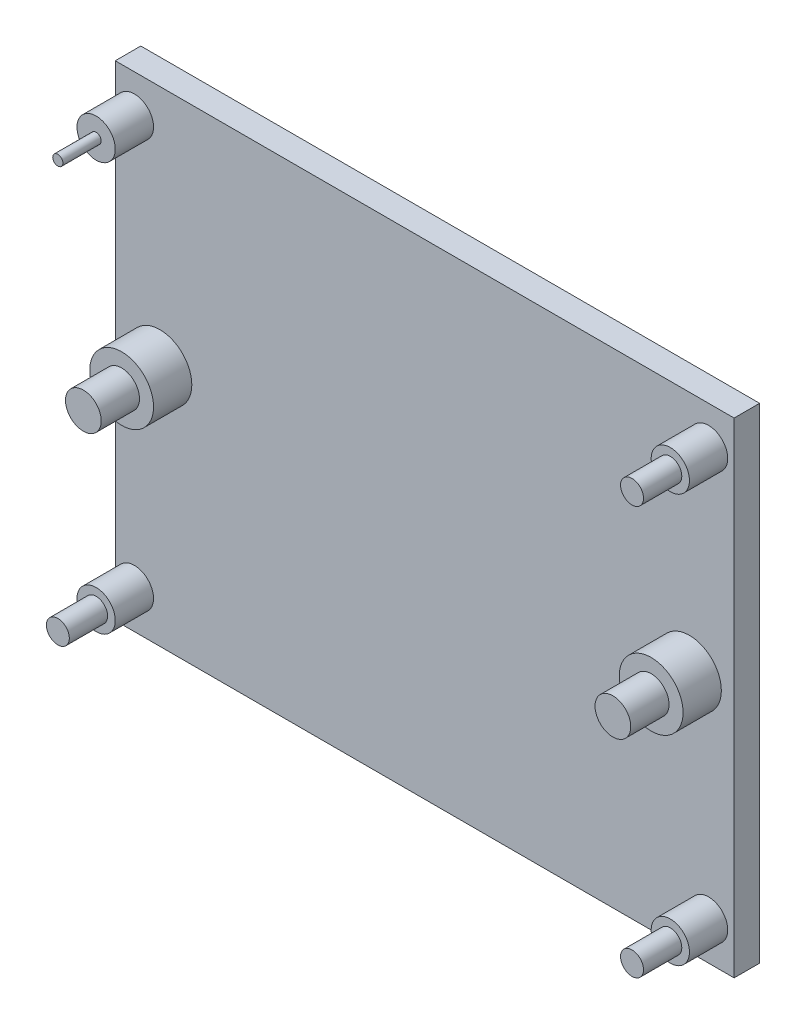
ISO-10303-21;
HEADER;
FILE_DESCRIPTION(('STEP AP214'),'2;1');
FILE_NAME('part.step','',(''),(''),'','','');
FILE_SCHEMA(('AUTOMOTIVE_DESIGN { 1 0 10303 214 1 1 1 1 }'));
ENDSEC;
DATA;
#1=APPLICATION_CONTEXT('core data for automotive mechanical design processes');
#2=APPLICATION_PROTOCOL_DEFINITION('international standard','automotive_design',2000,#1);
#3=PRODUCT_CONTEXT('',#1,'mechanical');
#4=PRODUCT('Part','Part','',(#3));
#5=PRODUCT_RELATED_PRODUCT_CATEGORY('part','',(#4));
#6=PRODUCT_DEFINITION_FORMATION('','',#4);
#7=PRODUCT_DEFINITION_CONTEXT('part definition',#1,'design');
#8=PRODUCT_DEFINITION('design','',#6,#7);
#9=PRODUCT_DEFINITION_SHAPE('','',#8);
#10=(LENGTH_UNIT() NAMED_UNIT(*) SI_UNIT(.MILLI.,.METRE.));
#11=(NAMED_UNIT(*) PLANE_ANGLE_UNIT() SI_UNIT($,.RADIAN.));
#12=(NAMED_UNIT(*) SI_UNIT($,.STERADIAN.) SOLID_ANGLE_UNIT());
#13=UNCERTAINTY_MEASURE_WITH_UNIT(LENGTH_MEASURE(1.E-05),#10,'distance_accuracy_value','');
#14=(GEOMETRIC_REPRESENTATION_CONTEXT(3) GLOBAL_UNCERTAINTY_ASSIGNED_CONTEXT((#13)) GLOBAL_UNIT_ASSIGNED_CONTEXT((#10,
#11,#12)) REPRESENTATION_CONTEXT('',''));
#15=CARTESIAN_POINT('',(0.,0.,0.));
#16=DIRECTION('',(0.,0.,1.));
#17=DIRECTION('',(1.,0.,0.));
#18=AXIS2_PLACEMENT_3D('',#15,#16,#17);
#19=CARTESIAN_POINT('',(0.,0.,0.));
#20=DIRECTION('',(0.,0.,1.));
#21=DIRECTION('',(1.,0.,0.));
#22=AXIS2_PLACEMENT_3D('',#19,#20,#21);
#23=PLANE('',#22);
#24=DIRECTION('',(-0.5,-0.866025403784438,0.));
#25=VECTOR('',#24,1.);
#26=CARTESIAN_POINT('',(-4.85,8.40044641670904,0.));
#27=LINE('',#26,#25);
#28=CARTESIAN_POINT('',(-4.85,8.40044641670904,0.));
#29=VERTEX_POINT('',#28);
#30=CARTESIAN_POINT('',(-9.69999999999999,0.,0.));
#31=VERTEX_POINT('',#30);
#32=EDGE_CURVE('E314',#29,#31,#27,.T.);
#33=ORIENTED_EDGE('',*,*,#32,.F.);
#34=DIRECTION('',(-1.,0.,0.));
#35=VECTOR('',#34,1.);
#36=CARTESIAN_POINT('',(4.85,8.40044641670904,0.));
#37=LINE('',#36,#35);
#38=CARTESIAN_POINT('',(4.85,8.40044641670904,0.));
#39=VERTEX_POINT('',#38);
#40=EDGE_CURVE('E322',#39,#29,#37,.T.);
#41=ORIENTED_EDGE('',*,*,#40,.F.);
#42=DIRECTION('',(-0.5,0.866025403784439,0.));
#43=VECTOR('',#42,1.);
#44=CARTESIAN_POINT('',(9.69999999999999,0.,0.));
#45=LINE('',#44,#43);
#46=CARTESIAN_POINT('',(9.69999999999999,0.,0.));
#47=VERTEX_POINT('',#46);
#48=EDGE_CURVE('E319',#47,#39,#45,.T.);
#49=ORIENTED_EDGE('',*,*,#48,.F.);
#50=DIRECTION('',(0.5,0.866025403784439,0.));
#51=VECTOR('',#50,1.);
#52=CARTESIAN_POINT('',(4.84999999999999,-8.40044641670905,0.));
#53=LINE('',#52,#51);
#54=CARTESIAN_POINT('',(4.84999999999999,-8.40044641670905,0.));
#55=VERTEX_POINT('',#54);
#56=EDGE_CURVE('E320',#55,#47,#53,.T.);
#57=ORIENTED_EDGE('',*,*,#56,.F.);
#58=DIRECTION('',(1.,0.,0.));
#59=VECTOR('',#58,1.);
#60=CARTESIAN_POINT('',(-4.85,-8.40044641670905,0.));
#61=LINE('',#60,#59);
#62=CARTESIAN_POINT('',(-4.85,-8.40044641670905,0.));
#63=VERTEX_POINT('',#62);
#64=EDGE_CURVE('E311',#63,#55,#61,.T.);
#65=ORIENTED_EDGE('',*,*,#64,.F.);
#66=DIRECTION('',(0.5,-0.866025403784439,0.));
#67=VECTOR('',#66,1.);
#68=CARTESIAN_POINT('',(-9.69999999999999,0.,0.));
#69=LINE('',#68,#67);
#70=EDGE_CURVE('E308',#31,#63,#69,.T.);
#71=ORIENTED_EDGE('',*,*,#70,.F.);
#72=EDGE_LOOP('',(#33,#41,#49,#57,#65,#71));
#73=FACE_BOUND('',#72,.T.);
#74=ADVANCED_FACE('F64',(#73),#23,.F.);
#75=CARTESIAN_POINT('',(0.,8.40044641670904,0.));
#76=DIRECTION('',(0.,-1.,0.));
#77=DIRECTION('',(0.,0.,-1.));
#78=AXIS2_PLACEMENT_3D('',#75,#76,#77);
#79=PLANE('',#78);
#80=DIRECTION('',(0.,0.,1.));
#81=VECTOR('',#80,1.);
#82=CARTESIAN_POINT('',(-4.85,8.40044641670904,0.));
#83=LINE('',#82,#81);
#84=CARTESIAN_POINT('',(-4.85,8.40044641670905,2.5));
#85=VERTEX_POINT('',#84);
#86=EDGE_CURVE('E328',#29,#85,#83,.T.);
#87=ORIENTED_EDGE('',*,*,#86,.T.);
#88=DIRECTION('',(-1.,0.,0.));
#89=VECTOR('',#88,1.);
#90=CARTESIAN_POINT('',(4.85,8.40044641670906,2.5));
#91=LINE('',#90,#89);
#92=CARTESIAN_POINT('',(4.85,8.40044641670906,2.5));
#93=VERTEX_POINT('',#92);
#94=EDGE_CURVE('E232',#93,#85,#91,.T.);
#95=ORIENTED_EDGE('',*,*,#94,.F.);
#96=DIRECTION('',(0.,0.,1.));
#97=VECTOR('',#96,1.);
#98=CARTESIAN_POINT('',(4.85,8.40044641670904,0.));
#99=LINE('',#98,#97);
#100=EDGE_CURVE('E347',#39,#93,#99,.T.);
#101=ORIENTED_EDGE('',*,*,#100,.F.);
#102=ORIENTED_EDGE('',*,*,#40,.T.);
#103=EDGE_LOOP('',(#87,#95,#101,#102));
#104=FACE_BOUND('',#103,.T.);
#105=ADVANCED_FACE('F270',(#104),#79,.F.);
#106=CARTESIAN_POINT('',(7.27499999999999,4.20022320835452,0.));
#107=DIRECTION('',(-0.866025403784439,-0.5,0.));
#108=DIRECTION('',(0.5,-0.866025403784439,0.));
#109=AXIS2_PLACEMENT_3D('',#106,#107,#108);
#110=PLANE('',#109);
#111=ORIENTED_EDGE('',*,*,#100,.T.);
#112=DIRECTION('',(-0.5,0.866025403784439,0.));
#113=VECTOR('',#112,1.);
#114=CARTESIAN_POINT('',(9.7,0.,2.5));
#115=LINE('',#114,#113);
#116=CARTESIAN_POINT('',(9.7,0.,2.5));
#117=VERTEX_POINT('',#116);
#118=EDGE_CURVE('E234',#117,#93,#115,.T.);
#119=ORIENTED_EDGE('',*,*,#118,.F.);
#120=DIRECTION('',(0.,0.,1.));
#121=VECTOR('',#120,1.);
#122=CARTESIAN_POINT('',(9.69999999999999,0.,0.));
#123=LINE('',#122,#121);
#124=EDGE_CURVE('E83',#47,#117,#123,.T.);
#125=ORIENTED_EDGE('',*,*,#124,.F.);
#126=ORIENTED_EDGE('',*,*,#48,.T.);
#127=EDGE_LOOP('',(#111,#119,#125,#126));
#128=FACE_BOUND('',#127,.T.);
#129=ADVANCED_FACE('F345',(#128),#110,.F.);
#130=CARTESIAN_POINT('',(-7.27499999999999,4.20022320835452,0.));
#131=DIRECTION('',(0.866025403784439,-0.5,0.));
#132=DIRECTION('',(0.5,0.866025403784439,0.));
#133=AXIS2_PLACEMENT_3D('',#130,#131,#132);
#134=PLANE('',#133);
#135=DIRECTION('',(0.,0.,1.));
#136=VECTOR('',#135,1.);
#137=CARTESIAN_POINT('',(-9.69999999999999,0.,0.));
#138=LINE('',#137,#136);
#139=CARTESIAN_POINT('',(-9.7,0.,2.5));
#140=VERTEX_POINT('',#139);
#141=EDGE_CURVE('E355',#31,#140,#138,.T.);
#142=ORIENTED_EDGE('',*,*,#141,.T.);
#143=DIRECTION('',(-0.5,-0.866025403784439,0.));
#144=VECTOR('',#143,1.);
#145=CARTESIAN_POINT('',(-4.85,8.40044641670905,2.5));
#146=LINE('',#145,#144);
#147=EDGE_CURVE('E230',#85,#140,#146,.T.);
#148=ORIENTED_EDGE('',*,*,#147,.F.);
#149=ORIENTED_EDGE('',*,*,#86,.F.);
#150=ORIENTED_EDGE('',*,*,#32,.T.);
#151=EDGE_LOOP('',(#142,#148,#149,#150));
#152=FACE_BOUND('',#151,.T.);
#153=ADVANCED_FACE('F373',(#152),#134,.F.);
#154=CARTESIAN_POINT('',(-7.275,-4.20022320835453,0.));
#155=DIRECTION('',(0.866025403784439,0.5,0.));
#156=DIRECTION('',(-0.5,0.866025403784439,0.));
#157=AXIS2_PLACEMENT_3D('',#154,#155,#156);
#158=PLANE('',#157);
#159=DIRECTION('',(0.,0.,1.));
#160=VECTOR('',#159,1.);
#161=CARTESIAN_POINT('',(-4.85,-8.40044641670905,0.));
#162=LINE('',#161,#160);
#163=CARTESIAN_POINT('',(-4.85,-8.40044641670905,2.5));
#164=VERTEX_POINT('',#163);
#165=EDGE_CURVE('E354',#63,#164,#162,.T.);
#166=ORIENTED_EDGE('',*,*,#165,.T.);
#167=DIRECTION('',(0.5,-0.866025403784439,0.));
#168=VECTOR('',#167,1.);
#169=CARTESIAN_POINT('',(-9.7,0.,2.5));
#170=LINE('',#169,#168);
#171=EDGE_CURVE('E231',#140,#164,#170,.T.);
#172=ORIENTED_EDGE('',*,*,#171,.F.);
#173=ORIENTED_EDGE('',*,*,#141,.F.);
#174=ORIENTED_EDGE('',*,*,#70,.T.);
#175=EDGE_LOOP('',(#166,#172,#173,#174));
#176=FACE_BOUND('',#175,.T.);
#177=ADVANCED_FACE('F385',(#176),#158,.F.);
#178=CARTESIAN_POINT('',(0.,-8.40044641670905,0.));
#179=DIRECTION('',(0.,1.,0.));
#180=DIRECTION('',(0.,0.,1.));
#181=AXIS2_PLACEMENT_3D('',#178,#179,#180);
#182=PLANE('',#181);
#183=DIRECTION('',(0.,0.,1.));
#184=VECTOR('',#183,1.);
#185=CARTESIAN_POINT('',(4.84999999999999,-8.40044641670905,0.));
#186=LINE('',#185,#184);
#187=CARTESIAN_POINT('',(4.85,-8.40044641670905,2.5));
#188=VERTEX_POINT('',#187);
#189=EDGE_CURVE('E540',#55,#188,#186,.T.);
#190=ORIENTED_EDGE('',*,*,#189,.T.);
#191=DIRECTION('',(1.,0.,0.));
#192=VECTOR('',#191,1.);
#193=CARTESIAN_POINT('',(-4.85,-8.40044641670905,2.5));
#194=LINE('',#193,#192);
#195=EDGE_CURVE('E241',#164,#188,#194,.T.);
#196=ORIENTED_EDGE('',*,*,#195,.F.);
#197=ORIENTED_EDGE('',*,*,#165,.F.);
#198=ORIENTED_EDGE('',*,*,#64,.T.);
#199=EDGE_LOOP('',(#190,#196,#197,#198));
#200=FACE_BOUND('',#199,.T.);
#201=ADVANCED_FACE('F536',(#200),#182,.F.);
#202=CARTESIAN_POINT('',(7.27499999999999,-4.20022320835452,0.));
#203=DIRECTION('',(-0.866025403784439,0.5,0.));
#204=DIRECTION('',(-0.5,-0.866025403784439,0.));
#205=AXIS2_PLACEMENT_3D('',#202,#203,#204);
#206=PLANE('',#205);
#207=ORIENTED_EDGE('',*,*,#124,.T.);
#208=DIRECTION('',(0.5,0.866025403784439,0.));
#209=VECTOR('',#208,1.);
#210=CARTESIAN_POINT('',(4.85,-8.40044641670905,2.5));
#211=LINE('',#210,#209);
#212=EDGE_CURVE('E90',#188,#117,#211,.T.);
#213=ORIENTED_EDGE('',*,*,#212,.F.);
#214=ORIENTED_EDGE('',*,*,#189,.F.);
#215=ORIENTED_EDGE('',*,*,#56,.T.);
#216=EDGE_LOOP('',(#207,#213,#214,#215));
#217=FACE_BOUND('',#216,.T.);
#218=ADVANCED_FACE('F67',(#217),#206,.F.);
#219=CARTESIAN_POINT('',(0.,0.115888344484453,0.491345886816737));
#220=DIRECTION('',(0.,-0.229560246535433,-0.973294453498319));
#221=DIRECTION('',(0.,0.973294453498319,-0.229560246535433));
#222=AXIS2_PLACEMENT_3D('',#219,#220,#221);
#223=PLANE('',#222);
#224=DIRECTION('',(-0.406826749036902,0.889109675367569,-0.209704509812836));
#225=VECTOR('',#224,1.);
#226=CARTESIAN_POINT('',(0.,-19.,5.));
#227=LINE('',#226,#225);
#228=CARTESIAN_POINT('',(0.,-19.,5.));
#229=VERTEX_POINT('',#228);
#230=EDGE_CURVE('E207',#229,#164,#227,.T.);
#231=ORIENTED_EDGE('',*,*,#230,.T.);
#232=ORIENTED_EDGE('',*,*,#195,.T.);
#233=DIRECTION('',(-0.871999916206676,0.476433496724633,-0.11237112322251));
#234=VECTOR('',#233,1.);
#235=CARTESIAN_POINT('',(24.25,-19.,5.));
#236=LINE('',#235,#234);
#237=CARTESIAN_POINT('',(24.25,-19.,5.));
#238=VERTEX_POINT('',#237);
#239=EDGE_CURVE('E424',#238,#188,#236,.T.);
#240=ORIENTED_EDGE('',*,*,#239,.F.);
#241=DIRECTION('',(1.,0.,0.));
#242=VECTOR('',#241,1.);
#243=CARTESIAN_POINT('',(24.25,-19.,5.));
#244=LINE('',#243,#242);
#245=EDGE_CURVE('E196',#229,#238,#244,.T.);
#246=ORIENTED_EDGE('',*,*,#245,.F.);
#247=EDGE_LOOP('',(#231,#232,#240,#246));
#248=FACE_BOUND('',#247,.T.);
#249=ADVANCED_FACE('F473',(#248),#223,.T.);
#250=CARTESIAN_POINT('',(24.25,19.,5.));
#251=CARTESIAN_POINT('',(9.7,0.,2.5));
#252=CARTESIAN_POINT('',(24.25,12.6666666666667,5.));
#253=CARTESIAN_POINT('',(8.89166666666666,-1.40007440278484,2.5));
#254=CARTESIAN_POINT('',(24.25,6.33333333333333,5.));
#255=CARTESIAN_POINT('',(8.08333333333333,-2.80014880556968,2.5));
#256=CARTESIAN_POINT('',(24.25,-6.33333333333334,5.));
#257=CARTESIAN_POINT('',(6.46666666666667,-5.60029761113936,2.5));
#258=CARTESIAN_POINT('',(24.25,-12.6666666666667,5.));
#259=CARTESIAN_POINT('',(5.65833333333333,-7.0003720139242,2.5));
#260=CARTESIAN_POINT('',(24.25,-19.,5.));
#261=CARTESIAN_POINT('',(4.85,-8.40044641670905,2.5));
#262=B_SPLINE_SURFACE_WITH_KNOTS('',3,1,((#250,#251),(#252,#253),(#254,#255),(#256,#257),(#258,
#259),(#260,#261)),.UNSPECIFIED.,.F.,.F.,.F.,(4,2,4),(2,2),(0.,0.5,1.),(0.,1.),.UNSPECIFIED.);
#263=DIRECTION('',(0.,1.,0.));
#264=VECTOR('',#263,1.);
#265=CARTESIAN_POINT('',(24.25,-19.,5.));
#266=LINE('',#265,#264);
#267=CARTESIAN_POINT('',(24.25,19.,5.));
#268=VERTEX_POINT('',#267);
#269=EDGE_CURVE('E205',#238,#268,#266,.T.);
#270=DIRECTION('',(-0.604702169192739,-0.789645444306669,-0.103900716356141));
#271=VECTOR('',#270,1.);
#272=CARTESIAN_POINT('',(16.975,9.50000000000001,3.75));
#273=LINE('',#272,#271);
#274=EDGE_CURVE('E340',#268,#117,#273,.T.);
#275=ORIENTED_EDGE('',*,*,#269,.F.);
#276=ORIENTED_EDGE('',*,*,#239,.T.);
#277=ORIENTED_EDGE('',*,*,#212,.T.);
#278=ORIENTED_EDGE('',*,*,#274,.F.);
#279=EDGE_LOOP('',(#275,#276,#277,#278));
#280=FACE_BOUND('',#279,.T.);
#281=ADVANCED_FACE('F459',(#280),#262,.T.);
#282=CARTESIAN_POINT('',(0.,-19.,5.));
#283=CARTESIAN_POINT('',(-4.85,-8.40044641670905,2.5));
#284=CARTESIAN_POINT('',(-4.04166666666667,-19.,5.));
#285=CARTESIAN_POINT('',(-5.65833333333333,-7.00037201392421,2.5));
#286=CARTESIAN_POINT('',(-8.08333333333334,-19.,5.));
#287=CARTESIAN_POINT('',(-6.46666666666666,-5.60029761113937,2.5));
#288=CARTESIAN_POINT('',(-16.1666666666667,-19.,5.));
#289=CARTESIAN_POINT('',(-8.08333333333333,-2.80014880556969,2.5));
#290=CARTESIAN_POINT('',(-20.2083333333333,-19.,5.));
#291=CARTESIAN_POINT('',(-8.89166666666666,-1.40007440278485,2.5));
#292=CARTESIAN_POINT('',(-24.25,-19.,5.));
#293=CARTESIAN_POINT('',(-9.7,0.,2.5));
#294=B_SPLINE_SURFACE_WITH_KNOTS('',3,1,((#282,#283),(#284,#285),(#286,#287),(#288,#289),(#290,
#291),(#292,#293)),.UNSPECIFIED.,.F.,.F.,.F.,(4,2,4),(2,2),(0.,0.5,1.),(0.,1.),.UNSPECIFIED.);
#295=CARTESIAN_POINT('',(-24.25,-19.,5.));
#296=VERTEX_POINT('',#295);
#297=EDGE_CURVE('E200',#296,#229,#244,.T.);
#298=DIRECTION('',(0.604702169192739,0.789645444306669,-0.103900716356141));
#299=VECTOR('',#298,1.);
#300=CARTESIAN_POINT('',(-16.975,-9.5,3.75));
#301=LINE('',#300,#299);
#302=EDGE_CURVE('E417',#296,#140,#301,.T.);
#303=ORIENTED_EDGE('',*,*,#297,.F.);
#304=ORIENTED_EDGE('',*,*,#302,.T.);
#305=ORIENTED_EDGE('',*,*,#171,.T.);
#306=ORIENTED_EDGE('',*,*,#230,.F.);
#307=EDGE_LOOP('',(#303,#304,#305,#306));
#308=FACE_BOUND('',#307,.T.);
#309=ADVANCED_FACE('F421',(#308),#294,.T.);
#310=CARTESIAN_POINT('',(-24.25,-19.,5.));
#311=CARTESIAN_POINT('',(-9.7,0.,2.5));
#312=CARTESIAN_POINT('',(-24.25,-12.6666666666667,5.));
#313=CARTESIAN_POINT('',(-8.89166666666666,1.40007440278484,2.5));
#314=CARTESIAN_POINT('',(-24.25,-6.33333333333332,5.));
#315=CARTESIAN_POINT('',(-8.08333333333333,2.80014880556968,2.5));
#316=CARTESIAN_POINT('',(-24.25,6.33333333333335,5.));
#317=CARTESIAN_POINT('',(-6.46666666666666,5.60029761113937,2.5));
#318=CARTESIAN_POINT('',(-24.25,12.6666666666667,5.));
#319=CARTESIAN_POINT('',(-5.65833333333333,7.00037201392421,2.5));
#320=CARTESIAN_POINT('',(-24.25,19.,5.));
#321=CARTESIAN_POINT('',(-4.85,8.40044641670905,2.5));
#322=B_SPLINE_SURFACE_WITH_KNOTS('',3,1,((#310,#311),(#312,#313),(#314,#315),(#316,#317),(#318,
#319),(#320,#321)),.UNSPECIFIED.,.F.,.F.,.F.,(4,2,4),(2,2),(0.,0.5,1.),(0.,1.),.UNSPECIFIED.);
#323=DIRECTION('',(0.,-1.,0.));
#324=VECTOR('',#323,1.);
#325=CARTESIAN_POINT('',(-24.25,-19.,5.));
#326=LINE('',#325,#324);
#327=CARTESIAN_POINT('',(-24.25,19.,5.));
#328=VERTEX_POINT('',#327);
#329=EDGE_CURVE('E198',#328,#296,#326,.T.);
#330=DIRECTION('',(0.871999916206676,-0.476433496724633,-0.11237112322251));
#331=VECTOR('',#330,1.);
#332=CARTESIAN_POINT('',(-14.55,13.7002232083545,3.75));
#333=LINE('',#332,#331);
#334=EDGE_CURVE('E419',#328,#85,#333,.T.);
#335=ORIENTED_EDGE('',*,*,#329,.F.);
#336=ORIENTED_EDGE('',*,*,#334,.T.);
#337=ORIENTED_EDGE('',*,*,#147,.T.);
#338=ORIENTED_EDGE('',*,*,#302,.F.);
#339=EDGE_LOOP('',(#335,#336,#337,#338));
#340=FACE_BOUND('',#339,.T.);
#341=ADVANCED_FACE('F418',(#340),#322,.T.);
#342=CARTESIAN_POINT('',(0.,-0.115888344484453,0.491345886816736));
#343=DIRECTION('',(0.,0.229560246535433,-0.973294453498319));
#344=DIRECTION('',(0.,0.973294453498319,0.229560246535433));
#345=AXIS2_PLACEMENT_3D('',#342,#343,#344);
#346=PLANE('',#345);
#347=DIRECTION('',(0.406826749036902,-0.889109675367569,-0.209704509812836));
#348=VECTOR('',#347,1.);
#349=CARTESIAN_POINT('',(0.,19.,5.));
#350=LINE('',#349,#348);
#351=CARTESIAN_POINT('',(0.,19.,5.));
#352=VERTEX_POINT('',#351);
#353=EDGE_CURVE('E426',#352,#93,#350,.T.);
#354=ORIENTED_EDGE('',*,*,#353,.T.);
#355=ORIENTED_EDGE('',*,*,#94,.T.);
#356=ORIENTED_EDGE('',*,*,#334,.F.);
#357=DIRECTION('',(-1.,0.,0.));
#358=VECTOR('',#357,1.);
#359=CARTESIAN_POINT('',(24.25,19.,5.));
#360=LINE('',#359,#358);
#361=EDGE_CURVE('E189',#352,#328,#360,.T.);
#362=ORIENTED_EDGE('',*,*,#361,.F.);
#363=EDGE_LOOP('',(#354,#355,#356,#362));
#364=FACE_BOUND('',#363,.T.);
#365=ADVANCED_FACE('F496',(#364),#346,.T.);
#366=CARTESIAN_POINT('',(0.,19.,5.));
#367=CARTESIAN_POINT('',(4.85,8.40044641670906,2.5));
#368=CARTESIAN_POINT('',(4.04166666666668,19.,5.));
#369=CARTESIAN_POINT('',(5.65833333333333,7.00037201392422,2.5));
#370=CARTESIAN_POINT('',(8.08333333333334,19.,5.));
#371=CARTESIAN_POINT('',(6.46666666666666,5.60029761113938,2.5));
#372=CARTESIAN_POINT('',(16.1666666666667,19.,5.));
#373=CARTESIAN_POINT('',(8.08333333333333,2.8001488055697,2.5));
#374=CARTESIAN_POINT('',(20.2083333333333,19.,5.));
#375=CARTESIAN_POINT('',(8.89166666666666,1.40007440278485,2.5));
#376=CARTESIAN_POINT('',(24.25,19.,5.));
#377=CARTESIAN_POINT('',(9.7,0.,2.5));
#378=B_SPLINE_SURFACE_WITH_KNOTS('',3,1,((#366,#367),(#368,#369),(#370,#371),(#372,#373),(#374,
#375),(#376,#377)),.UNSPECIFIED.,.F.,.F.,.F.,(4,2,4),(2,2),(0.,0.5,1.),(0.,1.),.UNSPECIFIED.);
#379=EDGE_CURVE('E70',#268,#352,#360,.T.);
#380=ORIENTED_EDGE('',*,*,#379,.F.);
#381=ORIENTED_EDGE('',*,*,#274,.T.);
#382=ORIENTED_EDGE('',*,*,#118,.T.);
#383=ORIENTED_EDGE('',*,*,#353,.F.);
#384=EDGE_LOOP('',(#380,#381,#382,#383));
#385=FACE_BOUND('',#384,.T.);
#386=ADVANCED_FACE('F267',(#385),#378,.T.);
#387=CARTESIAN_POINT('',(24.25,19.,7.));
#388=DIRECTION('',(0.,-1.,0.));
#389=DIRECTION('',(0.,0.,-1.));
#390=AXIS2_PLACEMENT_3D('',#387,#388,#389);
#391=PLANE('',#390);
#392=ORIENTED_EDGE('',*,*,#379,.T.);
#393=ORIENTED_EDGE('',*,*,#361,.T.);
#394=DIRECTION('',(0.,0.,-1.));
#395=VECTOR('',#394,1.);
#396=CARTESIAN_POINT('',(-24.25,19.,7.));
#397=LINE('',#396,#395);
#398=CARTESIAN_POINT('',(-24.25,19.,7.));
#399=VERTEX_POINT('',#398);
#400=EDGE_CURVE('E194',#399,#328,#397,.T.);
#401=ORIENTED_EDGE('',*,*,#400,.F.);
#402=DIRECTION('',(-1.,0.,0.));
#403=VECTOR('',#402,1.);
#404=CARTESIAN_POINT('',(24.25,19.,7.));
#405=LINE('',#404,#403);
#406=CARTESIAN_POINT('',(24.25,19.,7.));
#407=VERTEX_POINT('',#406);
#408=EDGE_CURVE('E167',#407,#399,#405,.T.);
#409=ORIENTED_EDGE('',*,*,#408,.F.);
#410=DIRECTION('',(0.,0.,-1.));
#411=VECTOR('',#410,1.);
#412=CARTESIAN_POINT('',(24.25,19.,7.));
#413=LINE('',#412,#411);
#414=EDGE_CURVE('E184',#407,#268,#413,.T.);
#415=ORIENTED_EDGE('',*,*,#414,.T.);
#416=EDGE_LOOP('',(#392,#393,#401,#409,#415));
#417=FACE_BOUND('',#416,.T.);
#418=ADVANCED_FACE('F520',(#417),#391,.F.);
#419=CARTESIAN_POINT('',(-24.25,-19.,7.));
#420=DIRECTION('',(1.,0.,0.));
#421=DIRECTION('',(0.,0.,-1.));
#422=AXIS2_PLACEMENT_3D('',#419,#420,#421);
#423=PLANE('',#422);
#424=ORIENTED_EDGE('',*,*,#329,.T.);
#425=DIRECTION('',(0.,0.,-1.));
#426=VECTOR('',#425,1.);
#427=CARTESIAN_POINT('',(-24.25,-19.,7.));
#428=LINE('',#427,#426);
#429=CARTESIAN_POINT('',(-24.25,-19.,7.));
#430=VERTEX_POINT('',#429);
#431=EDGE_CURVE('E213',#430,#296,#428,.T.);
#432=ORIENTED_EDGE('',*,*,#431,.F.);
#433=DIRECTION('',(0.,-1.,0.));
#434=VECTOR('',#433,1.);
#435=CARTESIAN_POINT('',(-24.25,-19.,7.));
#436=LINE('',#435,#434);
#437=CARTESIAN_POINT('',(-24.25,-16.,7.));
#438=VERTEX_POINT('',#437);
#439=EDGE_CURVE('E172',#438,#430,#436,.T.);
#440=ORIENTED_EDGE('',*,*,#439,.F.);
#441=CARTESIAN_POINT('',(-24.25,16.,7.));
#442=VERTEX_POINT('',#441);
#443=EDGE_CURVE('E171',#442,#438,#436,.T.);
#444=ORIENTED_EDGE('',*,*,#443,.F.);
#445=EDGE_CURVE('E159',#399,#442,#436,.T.);
#446=ORIENTED_EDGE('',*,*,#445,.F.);
#447=ORIENTED_EDGE('',*,*,#400,.T.);
#448=EDGE_LOOP('',(#424,#432,#440,#444,#446,#447));
#449=FACE_BOUND('',#448,.T.);
#450=ADVANCED_FACE('F176',(#449),#423,.F.);
#451=CARTESIAN_POINT('',(24.25,-19.,7.));
#452=DIRECTION('',(0.,1.,0.));
#453=DIRECTION('',(0.,0.,1.));
#454=AXIS2_PLACEMENT_3D('',#451,#452,#453);
#455=PLANE('',#454);
#456=ORIENTED_EDGE('',*,*,#297,.T.);
#457=ORIENTED_EDGE('',*,*,#245,.T.);
#458=DIRECTION('',(0.,0.,-1.));
#459=VECTOR('',#458,1.);
#460=CARTESIAN_POINT('',(24.25,-19.,7.));
#461=LINE('',#460,#459);
#462=CARTESIAN_POINT('',(24.25,-19.,7.));
#463=VERTEX_POINT('',#462);
#464=EDGE_CURVE('E217',#463,#238,#461,.T.);
#465=ORIENTED_EDGE('',*,*,#464,.F.);
#466=DIRECTION('',(1.,0.,0.));
#467=VECTOR('',#466,1.);
#468=CARTESIAN_POINT('',(24.25,-19.,7.));
#469=LINE('',#468,#467);
#470=EDGE_CURVE('E168',#430,#463,#469,.T.);
#471=ORIENTED_EDGE('',*,*,#470,.F.);
#472=ORIENTED_EDGE('',*,*,#431,.T.);
#473=EDGE_LOOP('',(#456,#457,#465,#471,#472));
#474=FACE_BOUND('',#473,.T.);
#475=ADVANCED_FACE('F526',(#474),#455,.F.);
#476=CARTESIAN_POINT('',(24.25,-19.,7.));
#477=DIRECTION('',(-1.,0.,0.));
#478=DIRECTION('',(0.,0.,1.));
#479=AXIS2_PLACEMENT_3D('',#476,#477,#478);
#480=PLANE('',#479);
#481=ORIENTED_EDGE('',*,*,#269,.T.);
#482=ORIENTED_EDGE('',*,*,#414,.F.);
#483=DIRECTION('',(0.,1.,0.));
#484=VECTOR('',#483,1.);
#485=CARTESIAN_POINT('',(24.25,-19.,7.));
#486=LINE('',#485,#484);
#487=EDGE_CURVE('E181',#463,#407,#486,.T.);
#488=ORIENTED_EDGE('',*,*,#487,.F.);
#489=ORIENTED_EDGE('',*,*,#464,.T.);
#490=EDGE_LOOP('',(#481,#482,#488,#489));
#491=FACE_BOUND('',#490,.T.);
#492=ADVANCED_FACE('F523',(#491),#480,.F.);
#493=CARTESIAN_POINT('',(0.,0.,7.));
#494=DIRECTION('',(0.,0.,-1.));
#495=DIRECTION('',(-1.,0.,0.));
#496=AXIS2_PLACEMENT_3D('',#493,#494,#495);
#497=PLANE('',#496);
#498=CARTESIAN_POINT('',(22.25,16.,7.));
#499=DIRECTION('',(0.,0.,1.));
#500=DIRECTION('',(1.,0.,0.));
#501=AXIS2_PLACEMENT_3D('',#498,#499,#500);
#502=CIRCLE('',#501,1.5);
#503=CARTESIAN_POINT('',(23.75,16.,7.));
#504=VERTEX_POINT('',#503);
#505=EDGE_CURVE('E948',#504,#504,#502,.T.);
#506=ORIENTED_EDGE('',*,*,#505,.F.);
#507=EDGE_LOOP('',(#506));
#508=FACE_BOUND('',#507,.T.);
#509=CARTESIAN_POINT('',(20.75,0.,7.));
#510=DIRECTION('',(0.,0.,1.));
#511=DIRECTION('',(1.,0.,0.));
#512=AXIS2_PLACEMENT_3D('',#509,#510,#511);
#513=CIRCLE('',#512,2.5);
#514=CARTESIAN_POINT('',(23.25,0.,7.));
#515=VERTEX_POINT('',#514);
#516=EDGE_CURVE('E961',#515,#515,#513,.T.);
#517=ORIENTED_EDGE('',*,*,#516,.F.);
#518=EDGE_LOOP('',(#517));
#519=FACE_BOUND('',#518,.T.);
#520=CARTESIAN_POINT('',(22.25,-16.,7.));
#521=DIRECTION('',(0.,0.,1.));
#522=DIRECTION('',(1.,0.,0.));
#523=AXIS2_PLACEMENT_3D('',#520,#521,#522);
#524=CIRCLE('',#523,1.5);
#525=CARTESIAN_POINT('',(23.75,-16.,7.));
#526=VERTEX_POINT('',#525);
#527=EDGE_CURVE('E957',#526,#526,#524,.T.);
#528=ORIENTED_EDGE('',*,*,#527,.F.);
#529=EDGE_LOOP('',(#528));
#530=FACE_BOUND('',#529,.T.);
#531=CARTESIAN_POINT('',(-20.75,0.,7.));
#532=DIRECTION('',(0.,0.,1.));
#533=DIRECTION('',(1.,0.,0.));
#534=AXIS2_PLACEMENT_3D('',#531,#532,#533);
#535=CIRCLE('',#534,2.5);
#536=CARTESIAN_POINT('',(-18.25,0.,7.));
#537=VERTEX_POINT('',#536);
#538=EDGE_CURVE('E962',#537,#537,#535,.T.);
#539=ORIENTED_EDGE('',*,*,#538,.F.);
#540=EDGE_LOOP('',(#539));
#541=FACE_BOUND('',#540,.T.);
#542=ORIENTED_EDGE('',*,*,#443,.T.);
#543=CARTESIAN_POINT('',(-22.75,-16.,7.));
#544=DIRECTION('',(0.,0.,1.));
#545=DIRECTION('',(1.,0.,0.));
#546=AXIS2_PLACEMENT_3D('',#543,#544,#545);
#547=CIRCLE('',#546,1.5);
#548=EDGE_CURVE('E968',#438,#438,#547,.T.);
#549=ORIENTED_EDGE('',*,*,#548,.F.);
#550=ORIENTED_EDGE('',*,*,#439,.T.);
#551=ORIENTED_EDGE('',*,*,#470,.T.);
#552=ORIENTED_EDGE('',*,*,#487,.T.);
#553=ORIENTED_EDGE('',*,*,#408,.T.);
#554=ORIENTED_EDGE('',*,*,#445,.T.);
#555=CARTESIAN_POINT('',(-22.75,16.,7.));
#556=DIRECTION('',(0.,0.,1.));
#557=DIRECTION('',(1.,0.,0.));
#558=AXIS2_PLACEMENT_3D('',#555,#556,#557);
#559=CIRCLE('',#558,1.5);
#560=EDGE_CURVE('E163',#442,#442,#559,.T.);
#561=ORIENTED_EDGE('',*,*,#560,.F.);
#562=EDGE_LOOP('',(#542,#549,#550,#551,#552,#553,#554,#561));
#563=FACE_BOUND('',#562,.T.);
#564=ADVANCED_FACE('F165',(#508,#519,#530,#541,#563),#497,.F.);
#565=CARTESIAN_POINT('',(-20.75,0.,10.));
#566=DIRECTION('',(0.,0.,-1.));
#567=DIRECTION('',(-1.,0.,0.));
#568=AXIS2_PLACEMENT_3D('',#565,#566,#567);
#569=CYLINDRICAL_SURFACE('',#568,2.5);
#570=CARTESIAN_POINT('',(-20.75,0.,10.));
#571=DIRECTION('',(0.,0.,1.));
#572=DIRECTION('',(1.,0.,0.));
#573=AXIS2_PLACEMENT_3D('',#570,#571,#572);
#574=CIRCLE('',#573,2.5);
#575=CARTESIAN_POINT('',(-18.25,0.,10.));
#576=VERTEX_POINT('',#575);
#577=EDGE_CURVE('E985',#576,#576,#574,.T.);
#578=ORIENTED_EDGE('',*,*,#577,.F.);
#579=EDGE_LOOP('',(#578));
#580=FACE_BOUND('',#579,.T.);
#581=ORIENTED_EDGE('',*,*,#538,.T.);
#582=EDGE_LOOP('',(#581));
#583=FACE_BOUND('',#582,.T.);
#584=ADVANCED_FACE('F679',(#580,#583),#569,.T.);
#585=CARTESIAN_POINT('',(-20.75,0.,10.));
#586=DIRECTION('',(0.,0.,1.));
#587=DIRECTION('',(1.,0.,0.));
#588=AXIS2_PLACEMENT_3D('',#585,#586,#587);
#589=PLANE('',#588);
#590=CARTESIAN_POINT('',(-20.75,0.,10.));
#591=DIRECTION('',(0.,0.,1.));
#592=DIRECTION('',(1.,0.,0.));
#593=AXIS2_PLACEMENT_3D('',#590,#591,#592);
#594=CIRCLE('',#593,1.4);
#595=CARTESIAN_POINT('',(-19.35,0.,10.));
#596=VERTEX_POINT('',#595);
#597=EDGE_CURVE('E12',#596,#596,#594,.T.);
#598=ORIENTED_EDGE('',*,*,#597,.F.);
#599=EDGE_LOOP('',(#598));
#600=FACE_BOUND('',#599,.T.);
#601=ORIENTED_EDGE('',*,*,#577,.T.);
#602=EDGE_LOOP('',(#601));
#603=FACE_BOUND('',#602,.T.);
#604=ADVANCED_FACE('F689',(#600,#603),#589,.T.);
#605=CARTESIAN_POINT('',(22.25,-16.,10.));
#606=DIRECTION('',(0.,0.,-1.));
#607=DIRECTION('',(-1.,0.,0.));
#608=AXIS2_PLACEMENT_3D('',#605,#606,#607);
#609=CYLINDRICAL_SURFACE('',#608,1.5);
#610=CARTESIAN_POINT('',(22.25,-16.,10.));
#611=DIRECTION('',(0.,0.,1.));
#612=DIRECTION('',(1.,0.,0.));
#613=AXIS2_PLACEMENT_3D('',#610,#611,#612);
#614=CIRCLE('',#613,1.5);
#615=CARTESIAN_POINT('',(23.75,-16.,10.));
#616=VERTEX_POINT('',#615);
#617=EDGE_CURVE('E953',#616,#616,#614,.T.);
#618=ORIENTED_EDGE('',*,*,#617,.F.);
#619=EDGE_LOOP('',(#618));
#620=FACE_BOUND('',#619,.T.);
#621=ORIENTED_EDGE('',*,*,#527,.T.);
#622=EDGE_LOOP('',(#621));
#623=FACE_BOUND('',#622,.T.);
#624=ADVANCED_FACE('F700',(#620,#623),#609,.T.);
#625=CARTESIAN_POINT('',(22.25,-16.,10.));
#626=DIRECTION('',(0.,0.,1.));
#627=DIRECTION('',(1.,0.,0.));
#628=AXIS2_PLACEMENT_3D('',#625,#626,#627);
#629=PLANE('',#628);
#630=CARTESIAN_POINT('',(22.25,-16.,10.));
#631=DIRECTION('',(0.,0.,1.));
#632=DIRECTION('',(1.,0.,0.));
#633=AXIS2_PLACEMENT_3D('',#630,#631,#632);
#634=CIRCLE('',#633,0.900000000000001);
#635=CARTESIAN_POINT('',(23.15,-16.,10.));
#636=VERTEX_POINT('',#635);
#637=EDGE_CURVE('E76',#636,#636,#634,.T.);
#638=ORIENTED_EDGE('',*,*,#637,.F.);
#639=EDGE_LOOP('',(#638));
#640=FACE_BOUND('',#639,.T.);
#641=ORIENTED_EDGE('',*,*,#617,.T.);
#642=EDGE_LOOP('',(#641));
#643=FACE_BOUND('',#642,.T.);
#644=ADVANCED_FACE('F706',(#640,#643),#629,.T.);
#645=CARTESIAN_POINT('',(20.75,0.,10.));
#646=DIRECTION('',(0.,0.,-1.));
#647=DIRECTION('',(-1.,0.,0.));
#648=AXIS2_PLACEMENT_3D('',#645,#646,#647);
#649=CYLINDRICAL_SURFACE('',#648,2.5);
#650=CARTESIAN_POINT('',(20.75,0.,10.));
#651=DIRECTION('',(0.,0.,1.));
#652=DIRECTION('',(1.,0.,0.));
#653=AXIS2_PLACEMENT_3D('',#650,#651,#652);
#654=CIRCLE('',#653,2.5);
#655=CARTESIAN_POINT('',(23.25,0.,10.));
#656=VERTEX_POINT('',#655);
#657=EDGE_CURVE('E977',#656,#656,#654,.T.);
#658=ORIENTED_EDGE('',*,*,#657,.F.);
#659=EDGE_LOOP('',(#658));
#660=FACE_BOUND('',#659,.T.);
#661=ORIENTED_EDGE('',*,*,#516,.T.);
#662=EDGE_LOOP('',(#661));
#663=FACE_BOUND('',#662,.T.);
#664=ADVANCED_FACE('F714',(#660,#663),#649,.T.);
#665=CARTESIAN_POINT('',(20.75,0.,10.));
#666=DIRECTION('',(0.,0.,1.));
#667=DIRECTION('',(1.,0.,0.));
#668=AXIS2_PLACEMENT_3D('',#665,#666,#667);
#669=PLANE('',#668);
#670=CARTESIAN_POINT('',(20.75,0.,10.));
#671=DIRECTION('',(0.,0.,1.));
#672=DIRECTION('',(1.,0.,0.));
#673=AXIS2_PLACEMENT_3D('',#670,#671,#672);
#674=CIRCLE('',#673,1.4);
#675=CARTESIAN_POINT('',(22.15,0.,10.));
#676=VERTEX_POINT('',#675);
#677=EDGE_CURVE('E941',#676,#676,#674,.T.);
#678=ORIENTED_EDGE('',*,*,#677,.F.);
#679=EDGE_LOOP('',(#678));
#680=FACE_BOUND('',#679,.T.);
#681=ORIENTED_EDGE('',*,*,#657,.T.);
#682=EDGE_LOOP('',(#681));
#683=FACE_BOUND('',#682,.T.);
#684=ADVANCED_FACE('F723',(#680,#683),#669,.T.);
#685=CARTESIAN_POINT('',(-22.75,16.,10.));
#686=DIRECTION('',(0.,0.,-1.));
#687=DIRECTION('',(-1.,0.,0.));
#688=AXIS2_PLACEMENT_3D('',#685,#686,#687);
#689=CYLINDRICAL_SURFACE('',#688,1.5);
#690=CARTESIAN_POINT('',(-22.75,16.,10.));
#691=DIRECTION('',(0.,0.,1.));
#692=DIRECTION('',(1.,0.,0.));
#693=AXIS2_PLACEMENT_3D('',#690,#691,#692);
#694=CIRCLE('',#693,1.5);
#695=CARTESIAN_POINT('',(-21.25,16.,10.));
#696=VERTEX_POINT('',#695);
#697=EDGE_CURVE('E970',#696,#696,#694,.T.);
#698=ORIENTED_EDGE('',*,*,#697,.F.);
#699=EDGE_LOOP('',(#698));
#700=FACE_BOUND('',#699,.T.);
#701=ORIENTED_EDGE('',*,*,#560,.T.);
#702=EDGE_LOOP('',(#701));
#703=FACE_BOUND('',#702,.T.);
#704=ADVANCED_FACE('F731',(#700,#703),#689,.T.);
#705=CARTESIAN_POINT('',(-22.75,16.,10.));
#706=DIRECTION('',(0.,0.,1.));
#707=DIRECTION('',(1.,0.,0.));
#708=AXIS2_PLACEMENT_3D('',#705,#706,#707);
#709=PLANE('',#708);
#710=CARTESIAN_POINT('',(-22.75,16.,10.));
#711=DIRECTION('',(0.,0.,1.));
#712=DIRECTION('',(1.,0.,0.));
#713=AXIS2_PLACEMENT_3D('',#710,#711,#712);
#714=CIRCLE('',#713,0.400000000000002);
#715=CARTESIAN_POINT('',(-22.35,16.,10.));
#716=VERTEX_POINT('',#715);
#717=EDGE_CURVE('E942',#716,#716,#714,.T.);
#718=ORIENTED_EDGE('',*,*,#717,.F.);
#719=EDGE_LOOP('',(#718));
#720=FACE_BOUND('',#719,.T.);
#721=ORIENTED_EDGE('',*,*,#697,.T.);
#722=EDGE_LOOP('',(#721));
#723=FACE_BOUND('',#722,.T.);
#724=ADVANCED_FACE('F742',(#720,#723),#709,.T.);
#725=CARTESIAN_POINT('',(-22.75,-16.,10.));
#726=DIRECTION('',(0.,0.,-1.));
#727=DIRECTION('',(-1.,0.,0.));
#728=AXIS2_PLACEMENT_3D('',#725,#726,#727);
#729=CYLINDRICAL_SURFACE('',#728,1.5);
#730=CARTESIAN_POINT('',(-22.75,-16.,10.));
#731=DIRECTION('',(0.,0.,1.));
#732=DIRECTION('',(1.,0.,0.));
#733=AXIS2_PLACEMENT_3D('',#730,#731,#732);
#734=CIRCLE('',#733,1.5);
#735=CARTESIAN_POINT('',(-21.25,-16.,10.));
#736=VERTEX_POINT('',#735);
#737=EDGE_CURVE('E969',#736,#736,#734,.T.);
#738=ORIENTED_EDGE('',*,*,#737,.F.);
#739=EDGE_LOOP('',(#738));
#740=FACE_BOUND('',#739,.T.);
#741=ORIENTED_EDGE('',*,*,#548,.T.);
#742=EDGE_LOOP('',(#741));
#743=FACE_BOUND('',#742,.T.);
#744=ADVANCED_FACE('F753',(#740,#743),#729,.T.);
#745=CARTESIAN_POINT('',(-22.75,-16.,10.));
#746=DIRECTION('',(0.,0.,1.));
#747=DIRECTION('',(1.,0.,0.));
#748=AXIS2_PLACEMENT_3D('',#745,#746,#747);
#749=PLANE('',#748);
#750=CARTESIAN_POINT('',(-22.75,-16.,10.));
#751=DIRECTION('',(0.,0.,1.));
#752=DIRECTION('',(1.,0.,0.));
#753=AXIS2_PLACEMENT_3D('',#750,#751,#752);
#754=CIRCLE('',#753,0.900000000000001);
#755=CARTESIAN_POINT('',(-21.85,-16.,10.));
#756=VERTEX_POINT('',#755);
#757=EDGE_CURVE('E949',#756,#756,#754,.T.);
#758=ORIENTED_EDGE('',*,*,#757,.F.);
#759=EDGE_LOOP('',(#758));
#760=FACE_BOUND('',#759,.T.);
#761=ORIENTED_EDGE('',*,*,#737,.T.);
#762=EDGE_LOOP('',(#761));
#763=FACE_BOUND('',#762,.T.);
#764=ADVANCED_FACE('F759',(#760,#763),#749,.T.);
#765=CARTESIAN_POINT('',(22.25,16.,10.));
#766=DIRECTION('',(0.,0.,-1.));
#767=DIRECTION('',(-1.,0.,0.));
#768=AXIS2_PLACEMENT_3D('',#765,#766,#767);
#769=CYLINDRICAL_SURFACE('',#768,1.5);
#770=CARTESIAN_POINT('',(22.25,16.,10.));
#771=DIRECTION('',(0.,0.,1.));
#772=DIRECTION('',(1.,0.,0.));
#773=AXIS2_PLACEMENT_3D('',#770,#771,#772);
#774=CIRCLE('',#773,1.5);
#775=CARTESIAN_POINT('',(23.75,16.,10.));
#776=VERTEX_POINT('',#775);
#777=EDGE_CURVE('E965',#776,#776,#774,.T.);
#778=ORIENTED_EDGE('',*,*,#777,.F.);
#779=EDGE_LOOP('',(#778));
#780=FACE_BOUND('',#779,.T.);
#781=ORIENTED_EDGE('',*,*,#505,.T.);
#782=EDGE_LOOP('',(#781));
#783=FACE_BOUND('',#782,.T.);
#784=ADVANCED_FACE('F768',(#780,#783),#769,.T.);
#785=CARTESIAN_POINT('',(22.25,16.,10.));
#786=DIRECTION('',(0.,0.,1.));
#787=DIRECTION('',(1.,0.,0.));
#788=AXIS2_PLACEMENT_3D('',#785,#786,#787);
#789=PLANE('',#788);
#790=CARTESIAN_POINT('',(22.25,16.,10.));
#791=DIRECTION('',(0.,0.,1.));
#792=DIRECTION('',(1.,0.,0.));
#793=AXIS2_PLACEMENT_3D('',#790,#791,#792);
#794=CIRCLE('',#793,0.900000000000001);
#795=CARTESIAN_POINT('',(23.15,16.,10.));
#796=VERTEX_POINT('',#795);
#797=EDGE_CURVE('E944',#796,#796,#794,.T.);
#798=ORIENTED_EDGE('',*,*,#797,.F.);
#799=EDGE_LOOP('',(#798));
#800=FACE_BOUND('',#799,.T.);
#801=ORIENTED_EDGE('',*,*,#777,.T.);
#802=EDGE_LOOP('',(#801));
#803=FACE_BOUND('',#802,.T.);
#804=ADVANCED_FACE('F777',(#800,#803),#789,.T.);
#805=CARTESIAN_POINT('',(22.25,16.,13.));
#806=DIRECTION('',(0.,0.,-1.));
#807=DIRECTION('',(-1.,0.,0.));
#808=AXIS2_PLACEMENT_3D('',#805,#806,#807);
#809=CYLINDRICAL_SURFACE('',#808,0.900000000000001);
#810=CARTESIAN_POINT('',(22.25,16.,13.));
#811=DIRECTION('',(0.,0.,1.));
#812=DIRECTION('',(1.,0.,0.));
#813=AXIS2_PLACEMENT_3D('',#810,#811,#812);
#814=CIRCLE('',#813,0.900000000000001);
#815=CARTESIAN_POINT('',(23.15,16.,13.));
#816=VERTEX_POINT('',#815);
#817=EDGE_CURVE('E939',#816,#816,#814,.T.);
#818=ORIENTED_EDGE('',*,*,#817,.F.);
#819=EDGE_LOOP('',(#818));
#820=FACE_BOUND('',#819,.T.);
#821=ORIENTED_EDGE('',*,*,#797,.T.);
#822=EDGE_LOOP('',(#821));
#823=FACE_BOUND('',#822,.T.);
#824=ADVANCED_FACE('F790',(#820,#823),#809,.T.);
#825=CARTESIAN_POINT('',(22.25,16.,13.));
#826=DIRECTION('',(0.,0.,1.));
#827=DIRECTION('',(1.,0.,0.));
#828=AXIS2_PLACEMENT_3D('',#825,#826,#827);
#829=PLANE('',#828);
#830=ORIENTED_EDGE('',*,*,#817,.T.);
#831=EDGE_LOOP('',(#830));
#832=FACE_BOUND('',#831,.T.);
#833=ADVANCED_FACE('F796',(#832),#829,.T.);
#834=CARTESIAN_POINT('',(-22.75,-16.,13.));
#835=DIRECTION('',(0.,0.,-1.));
#836=DIRECTION('',(-1.,0.,0.));
#837=AXIS2_PLACEMENT_3D('',#834,#835,#836);
#838=CYLINDRICAL_SURFACE('',#837,0.900000000000001);
#839=CARTESIAN_POINT('',(-22.75,-16.,13.));
#840=DIRECTION('',(0.,0.,1.));
#841=DIRECTION('',(1.,0.,0.));
#842=AXIS2_PLACEMENT_3D('',#839,#840,#841);
#843=CIRCLE('',#842,0.900000000000001);
#844=CARTESIAN_POINT('',(-21.85,-16.,13.));
#845=VERTEX_POINT('',#844);
#846=EDGE_CURVE('E931',#845,#845,#843,.T.);
#847=ORIENTED_EDGE('',*,*,#846,.F.);
#848=EDGE_LOOP('',(#847));
#849=FACE_BOUND('',#848,.T.);
#850=ORIENTED_EDGE('',*,*,#757,.T.);
#851=EDGE_LOOP('',(#850));
#852=FACE_BOUND('',#851,.T.);
#853=ADVANCED_FACE('F804',(#849,#852),#838,.T.);
#854=CARTESIAN_POINT('',(-22.75,-16.,13.));
#855=DIRECTION('',(0.,0.,1.));
#856=DIRECTION('',(1.,0.,0.));
#857=AXIS2_PLACEMENT_3D('',#854,#855,#856);
#858=PLANE('',#857);
#859=ORIENTED_EDGE('',*,*,#846,.T.);
#860=EDGE_LOOP('',(#859));
#861=FACE_BOUND('',#860,.T.);
#862=ADVANCED_FACE('F812',(#861),#858,.T.);
#863=CARTESIAN_POINT('',(-22.75,16.,13.));
#864=DIRECTION('',(0.,0.,-1.));
#865=DIRECTION('',(-1.,0.,0.));
#866=AXIS2_PLACEMENT_3D('',#863,#864,#865);
#867=CYLINDRICAL_SURFACE('',#866,0.400000000000002);
#868=CARTESIAN_POINT('',(-22.75,16.,13.));
#869=DIRECTION('',(0.,0.,1.));
#870=DIRECTION('',(1.,0.,0.));
#871=AXIS2_PLACEMENT_3D('',#868,#869,#870);
#872=CIRCLE('',#871,0.400000000000002);
#873=CARTESIAN_POINT('',(-22.35,16.,13.));
#874=VERTEX_POINT('',#873);
#875=EDGE_CURVE('E934',#874,#874,#872,.T.);
#876=ORIENTED_EDGE('',*,*,#875,.F.);
#877=EDGE_LOOP('',(#876));
#878=FACE_BOUND('',#877,.T.);
#879=ORIENTED_EDGE('',*,*,#717,.T.);
#880=EDGE_LOOP('',(#879));
#881=FACE_BOUND('',#880,.T.);
#882=ADVANCED_FACE('F822',(#878,#881),#867,.T.);
#883=CARTESIAN_POINT('',(-22.75,16.,13.));
#884=DIRECTION('',(0.,0.,1.));
#885=DIRECTION('',(1.,0.,0.));
#886=AXIS2_PLACEMENT_3D('',#883,#884,#885);
#887=PLANE('',#886);
#888=ORIENTED_EDGE('',*,*,#875,.T.);
#889=EDGE_LOOP('',(#888));
#890=FACE_BOUND('',#889,.T.);
#891=ADVANCED_FACE('F835',(#890),#887,.T.);
#892=CARTESIAN_POINT('',(20.75,0.,13.));
#893=DIRECTION('',(0.,0.,-1.));
#894=DIRECTION('',(-1.,0.,0.));
#895=AXIS2_PLACEMENT_3D('',#892,#893,#894);
#896=CYLINDRICAL_SURFACE('',#895,1.4);
#897=CARTESIAN_POINT('',(20.75,0.,13.));
#898=DIRECTION('',(0.,0.,1.));
#899=DIRECTION('',(1.,0.,0.));
#900=AXIS2_PLACEMENT_3D('',#897,#898,#899);
#901=CIRCLE('',#900,1.4);
#902=CARTESIAN_POINT('',(22.15,0.,13.));
#903=VERTEX_POINT('',#902);
#904=EDGE_CURVE('E935',#903,#903,#901,.T.);
#905=ORIENTED_EDGE('',*,*,#904,.F.);
#906=EDGE_LOOP('',(#905));
#907=FACE_BOUND('',#906,.T.);
#908=ORIENTED_EDGE('',*,*,#677,.T.);
#909=EDGE_LOOP('',(#908));
#910=FACE_BOUND('',#909,.T.);
#911=ADVANCED_FACE('F842',(#907,#910),#896,.T.);
#912=CARTESIAN_POINT('',(20.75,0.,13.));
#913=DIRECTION('',(0.,0.,1.));
#914=DIRECTION('',(1.,0.,0.));
#915=AXIS2_PLACEMENT_3D('',#912,#913,#914);
#916=PLANE('',#915);
#917=ORIENTED_EDGE('',*,*,#904,.T.);
#918=EDGE_LOOP('',(#917));
#919=FACE_BOUND('',#918,.T.);
#920=ADVANCED_FACE('F849',(#919),#916,.T.);
#921=CARTESIAN_POINT('',(22.25,-16.,13.));
#922=DIRECTION('',(0.,0.,-1.));
#923=DIRECTION('',(-1.,0.,0.));
#924=AXIS2_PLACEMENT_3D('',#921,#922,#923);
#925=CYLINDRICAL_SURFACE('',#924,0.900000000000001);
#926=CARTESIAN_POINT('',(22.25,-16.,13.));
#927=DIRECTION('',(0.,0.,1.));
#928=DIRECTION('',(1.,0.,0.));
#929=AXIS2_PLACEMENT_3D('',#926,#927,#928);
#930=CIRCLE('',#929,0.900000000000001);
#931=CARTESIAN_POINT('',(23.15,-16.,13.));
#932=VERTEX_POINT('',#931);
#933=EDGE_CURVE('E955',#932,#932,#930,.T.);
#934=ORIENTED_EDGE('',*,*,#933,.F.);
#935=EDGE_LOOP('',(#934));
#936=FACE_BOUND('',#935,.T.);
#937=ORIENTED_EDGE('',*,*,#637,.T.);
#938=EDGE_LOOP('',(#937));
#939=FACE_BOUND('',#938,.T.);
#940=ADVANCED_FACE('F860',(#936,#939),#925,.T.);
#941=CARTESIAN_POINT('',(22.25,-16.,13.));
#942=DIRECTION('',(0.,0.,1.));
#943=DIRECTION('',(1.,0.,0.));
#944=AXIS2_PLACEMENT_3D('',#941,#942,#943);
#945=PLANE('',#944);
#946=ORIENTED_EDGE('',*,*,#933,.T.);
#947=EDGE_LOOP('',(#946));
#948=FACE_BOUND('',#947,.T.);
#949=ADVANCED_FACE('F868',(#948),#945,.T.);
#950=CARTESIAN_POINT('',(-20.75,0.,13.));
#951=DIRECTION('',(0.,0.,-1.));
#952=DIRECTION('',(-1.,0.,0.));
#953=AXIS2_PLACEMENT_3D('',#950,#951,#952);
#954=CYLINDRICAL_SURFACE('',#953,1.4);
#955=CARTESIAN_POINT('',(-20.75,0.,13.));
#956=DIRECTION('',(0.,0.,1.));
#957=DIRECTION('',(1.,0.,0.));
#958=AXIS2_PLACEMENT_3D('',#955,#956,#957);
#959=CIRCLE('',#958,1.4);
#960=CARTESIAN_POINT('',(-19.35,0.,13.));
#961=VERTEX_POINT('',#960);
#962=EDGE_CURVE('E929',#961,#961,#959,.T.);
#963=ORIENTED_EDGE('',*,*,#962,.F.);
#964=EDGE_LOOP('',(#963));
#965=FACE_BOUND('',#964,.T.);
#966=ORIENTED_EDGE('',*,*,#597,.T.);
#967=EDGE_LOOP('',(#966));
#968=FACE_BOUND('',#967,.T.);
#969=ADVANCED_FACE('F880',(#965,#968),#954,.T.);
#970=CARTESIAN_POINT('',(-20.75,0.,13.));
#971=DIRECTION('',(0.,0.,1.));
#972=DIRECTION('',(1.,0.,0.));
#973=AXIS2_PLACEMENT_3D('',#970,#971,#972);
#974=PLANE('',#973);
#975=ORIENTED_EDGE('',*,*,#962,.T.);
#976=EDGE_LOOP('',(#975));
#977=FACE_BOUND('',#976,.T.);
#978=ADVANCED_FACE('F886',(#977),#974,.T.);
#979=CLOSED_SHELL('',(#74,#105,#129,#153,#177,#201,#218,#249,#281,#309,#341,#365,#386,#418,#450,
#475,#492,#564,#584,#604,#624,#644,#664,#684,#704,#724,#744,#764,#784,#804,#824,#833,#853,#862,
#882,#891,#911,#920,#940,#949,#969,#978));
#980=MANIFOLD_SOLID_BREP('B2',#979);
#981=ADVANCED_BREP_SHAPE_REPRESENTATION('',(#18,#980),#14);
#982=SHAPE_DEFINITION_REPRESENTATION(#9,#981);
ENDSEC;
END-ISO-10303-21;
